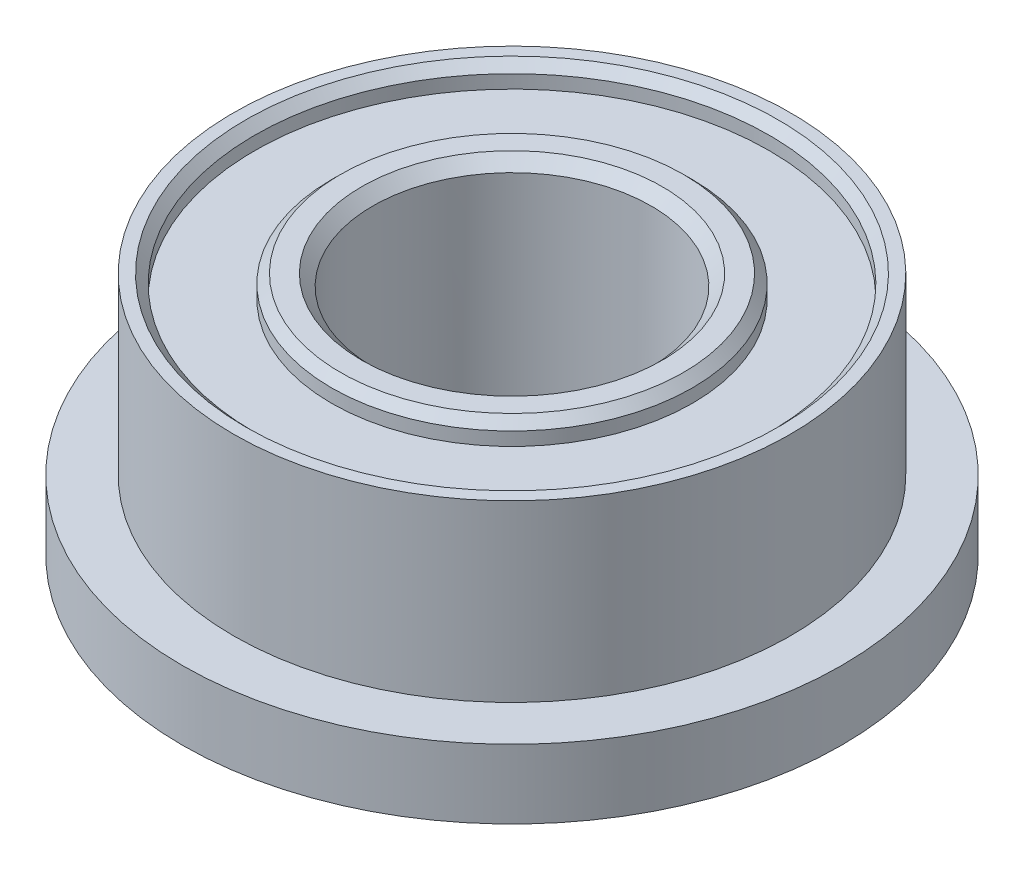
ISO-10303-21;
HEADER;
FILE_DESCRIPTION(('STEP AP214'),'2;1');
FILE_NAME('part.step','',(''),(''),'','','');
FILE_SCHEMA(('AUTOMOTIVE_DESIGN { 1 0 10303 214 1 1 1 1 }'));
ENDSEC;
DATA;
#1=APPLICATION_CONTEXT('core data for automotive mechanical design processes');
#2=APPLICATION_PROTOCOL_DEFINITION('international standard','automotive_design',2000,#1);
#3=PRODUCT_CONTEXT('',#1,'mechanical');
#4=PRODUCT('Part','Part','',(#3));
#5=PRODUCT_RELATED_PRODUCT_CATEGORY('part','',(#4));
#6=PRODUCT_DEFINITION_FORMATION('','',#4);
#7=PRODUCT_DEFINITION_CONTEXT('part definition',#1,'design');
#8=PRODUCT_DEFINITION('design','',#6,#7);
#9=PRODUCT_DEFINITION_SHAPE('','',#8);
#10=(LENGTH_UNIT() NAMED_UNIT(*) SI_UNIT(.MILLI.,.METRE.));
#11=(NAMED_UNIT(*) PLANE_ANGLE_UNIT() SI_UNIT($,.RADIAN.));
#12=(NAMED_UNIT(*) SI_UNIT($,.STERADIAN.) SOLID_ANGLE_UNIT());
#13=UNCERTAINTY_MEASURE_WITH_UNIT(LENGTH_MEASURE(1.E-05),#10,'distance_accuracy_value','');
#14=(GEOMETRIC_REPRESENTATION_CONTEXT(3) GLOBAL_UNCERTAINTY_ASSIGNED_CONTEXT((#13)) GLOBAL_UNIT_ASSIGNED_CONTEXT((#10,
#11,#12)) REPRESENTATION_CONTEXT('',''));
#15=CARTESIAN_POINT('',(0.,0.,0.));
#16=DIRECTION('',(0.,0.,1.));
#17=DIRECTION('',(1.,0.,0.));
#18=AXIS2_PLACEMENT_3D('',#15,#16,#17);
#19=CARTESIAN_POINT('',(0.,-8.02640000000565,0.));
#20=DIRECTION('',(0.,-1.,0.));
#21=DIRECTION('',(0.,0.,-1.));
#22=AXIS2_PLACEMENT_3D('',#19,#20,#21);
#23=CONICAL_SURFACE('',#22,1.71449999996074,0.7853981634499);
#24=CARTESIAN_POINT('',(0.,-8.02640000000565,0.));
#25=DIRECTION('',(0.,-1.,0.));
#26=DIRECTION('',(0.,0.,-1.));
#27=AXIS2_PLACEMENT_3D('',#24,#25,#26);
#28=CIRCLE('',#27,1.71449999996074);
#29=CARTESIAN_POINT('',(0.,-8.02640000000565,-1.71449999996074));
#30=VERTEX_POINT('',#29);
#31=EDGE_CURVE('E18',#30,#30,#28,.F.);
#32=ORIENTED_EDGE('',*,*,#31,.F.);
#33=EDGE_LOOP('',(#32));
#34=FACE_BOUND('',#33,.T.);
#35=CARTESIAN_POINT('',(0.,-7.8994,0.));
#36=DIRECTION('',(0.,1.,0.));
#37=DIRECTION('',(0.,0.,1.));
#38=AXIS2_PLACEMENT_3D('',#35,#36,#37);
#39=CIRCLE('',#38,1.5875);
#40=CARTESIAN_POINT('',(0.,-7.8994,1.5875));
#41=VERTEX_POINT('',#40);
#42=EDGE_CURVE('E30',#41,#41,#39,.T.);
#43=ORIENTED_EDGE('',*,*,#42,.T.);
#44=EDGE_LOOP('',(#43));
#45=FACE_BOUND('',#44,.T.);
#46=ADVANCED_FACE('F15',(#34,#45),#23,.F.);
#47=CARTESIAN_POINT('',(0.,-8.0264,0.));
#48=DIRECTION('',(0.,1.,0.));
#49=DIRECTION('',(0.,0.,1.));
#50=AXIS2_PLACEMENT_3D('',#47,#48,#49);
#51=CYLINDRICAL_SURFACE('',#50,1.5875);
#52=CARTESIAN_POINT('',(0.,-5.37464000001364,0.));
#53=DIRECTION('',(0.,1.,0.));
#54=DIRECTION('',(-0.990358822094107,0.,-0.138525822503868));
#55=AXIS2_PLACEMENT_3D('',#52,#53,#54);
#56=CIRCLE('',#55,1.58749999998275);
#57=CARTESIAN_POINT('',(-1.57219463005731,-5.37464000001364,-0.219909743222502));
#58=VERTEX_POINT('',#57);
#59=EDGE_CURVE('E67',#58,#58,#56,.T.);
#60=ORIENTED_EDGE('',*,*,#59,.T.);
#61=EDGE_LOOP('',(#60));
#62=FACE_BOUND('',#61,.T.);
#63=ORIENTED_EDGE('',*,*,#42,.F.);
#64=EDGE_LOOP('',(#63));
#65=FACE_BOUND('',#64,.T.);
#66=ADVANCED_FACE('F266',(#62,#65),#51,.F.);
#67=CARTESIAN_POINT('',(0.,-8.0264,0.));
#68=DIRECTION('',(0.,-1.,0.));
#69=DIRECTION('',(0.,0.,-1.));
#70=AXIS2_PLACEMENT_3D('',#67,#68,#69);
#71=PLANE('',#70);
#72=ORIENTED_EDGE('',*,*,#31,.T.);
#73=EDGE_LOOP('',(#72));
#74=FACE_BOUND('',#73,.T.);
#75=CARTESIAN_POINT('',(0.,-8.02640000000565,0.));
#76=DIRECTION('',(0.,1.,0.));
#77=DIRECTION('',(0.,0.,1.));
#78=AXIS2_PLACEMENT_3D('',#75,#76,#77);
#79=CIRCLE('',#78,1.95580000005167);
#80=CARTESIAN_POINT('',(0.,-8.02640000000565,1.95580000005167));
#81=VERTEX_POINT('',#80);
#82=EDGE_CURVE('E65',#81,#81,#79,.T.);
#83=ORIENTED_EDGE('',*,*,#82,.F.);
#84=EDGE_LOOP('',(#83));
#85=FACE_BOUND('',#84,.T.);
#86=ADVANCED_FACE('F257',(#74,#85),#71,.T.);
#87=CARTESIAN_POINT('',(0.,-5.24764000005007,0.));
#88=DIRECTION('',(0.,1.,0.));
#89=DIRECTION('',(0.,0.,1.));
#90=AXIS2_PLACEMENT_3D('',#87,#88,#89);
#91=CONICAL_SURFACE('',#90,1.71449999995877,0.785398163446465);
#92=CARTESIAN_POINT('',(0.,-5.24763999999181,0.));
#93=DIRECTION('',(0.,1.,0.));
#94=DIRECTION('',(0.,0.,1.));
#95=AXIS2_PLACEMENT_3D('',#92,#93,#94);
#96=CIRCLE('',#95,1.71450000001704);
#97=CARTESIAN_POINT('',(0.,-5.24763999999181,1.71450000001704));
#98=VERTEX_POINT('',#97);
#99=EDGE_CURVE('E63',#98,#98,#96,.T.);
#100=ORIENTED_EDGE('',*,*,#99,.T.);
#101=EDGE_LOOP('',(#100));
#102=FACE_BOUND('',#101,.T.);
#103=ORIENTED_EDGE('',*,*,#59,.F.);
#104=EDGE_LOOP('',(#103));
#105=FACE_BOUND('',#104,.T.);
#106=ADVANCED_FACE('F249',(#102,#105),#91,.F.);
#107=CARTESIAN_POINT('',(0.,-7.92480000001206,0.));
#108=DIRECTION('',(0.,1.,0.));
#109=DIRECTION('',(0.,0.,1.));
#110=AXIS2_PLACEMENT_3D('',#107,#108,#109);
#111=CONICAL_SURFACE('',#110,2.05740000002005,0.785398163273348);
#112=ORIENTED_EDGE('',*,*,#82,.T.);
#113=EDGE_LOOP('',(#112));
#114=FACE_BOUND('',#113,.T.);
#115=CARTESIAN_POINT('',(0.,-7.9248,0.));
#116=DIRECTION('',(0.,-1.,0.));
#117=DIRECTION('',(0.,0.,-1.));
#118=AXIS2_PLACEMENT_3D('',#115,#116,#117);
#119=CIRCLE('',#118,2.0574);
#120=CARTESIAN_POINT('',(0.,-7.9248,-2.0574));
#121=VERTEX_POINT('',#120);
#122=EDGE_CURVE('E62',#121,#121,#119,.F.);
#123=ORIENTED_EDGE('',*,*,#122,.F.);
#124=EDGE_LOOP('',(#123));
#125=FACE_BOUND('',#124,.T.);
#126=ADVANCED_FACE('F240',(#114,#125),#111,.T.);
#127=CARTESIAN_POINT('',(0.,-5.24764,0.));
#128=DIRECTION('',(0.,-1.,0.));
#129=DIRECTION('',(0.,0.,-1.));
#130=AXIS2_PLACEMENT_3D('',#127,#128,#129);
#131=PLANE('',#130);
#132=ORIENTED_EDGE('',*,*,#99,.F.);
#133=EDGE_LOOP('',(#132));
#134=FACE_BOUND('',#133,.T.);
#135=CARTESIAN_POINT('',(0.,-5.24763999999323,0.));
#136=DIRECTION('',(0.,-1.,0.));
#137=DIRECTION('',(0.,0.,-1.));
#138=AXIS2_PLACEMENT_3D('',#135,#136,#137);
#139=CIRCLE('',#138,1.95579999999538);
#140=CARTESIAN_POINT('',(0.,-5.24763999999323,-1.95579999999538));
#141=VERTEX_POINT('',#140);
#142=EDGE_CURVE('E59',#141,#141,#139,.T.);
#143=ORIENTED_EDGE('',*,*,#142,.F.);
#144=EDGE_LOOP('',(#143));
#145=FACE_BOUND('',#144,.T.);
#146=ADVANCED_FACE('F231',(#134,#145),#131,.F.);
#147=CARTESIAN_POINT('',(0.,-7.5184,0.));
#148=DIRECTION('',(0.,-1.,0.));
#149=DIRECTION('',(0.,0.,-1.));
#150=AXIS2_PLACEMENT_3D('',#147,#148,#149);
#151=CYLINDRICAL_SURFACE('',#150,2.0574);
#152=CARTESIAN_POINT('',(0.,-7.5184,0.));
#153=DIRECTION('',(0.,-1.,0.));
#154=DIRECTION('',(0.,0.,-1.));
#155=AXIS2_PLACEMENT_3D('',#152,#153,#154);
#156=CIRCLE('',#155,2.0574);
#157=CARTESIAN_POINT('',(0.,-7.5184,-2.0574));
#158=VERTEX_POINT('',#157);
#159=EDGE_CURVE('E56',#158,#158,#156,.F.);
#160=ORIENTED_EDGE('',*,*,#159,.F.);
#161=EDGE_LOOP('',(#160));
#162=FACE_BOUND('',#161,.T.);
#163=ORIENTED_EDGE('',*,*,#122,.T.);
#164=EDGE_LOOP('',(#163));
#165=FACE_BOUND('',#164,.T.);
#166=ADVANCED_FACE('F222',(#162,#165),#151,.T.);
#167=CARTESIAN_POINT('',(0.,-5.34923999998682,0.));
#168=DIRECTION('',(0.,-1.,0.));
#169=DIRECTION('',(0.,0.,-1.));
#170=AXIS2_PLACEMENT_3D('',#167,#168,#169);
#171=CONICAL_SURFACE('',#170,2.05739999996572,0.785398163283033);
#172=ORIENTED_EDGE('',*,*,#142,.T.);
#173=EDGE_LOOP('',(#172));
#174=FACE_BOUND('',#173,.T.);
#175=CARTESIAN_POINT('',(0.,-5.34924,0.));
#176=DIRECTION('',(0.,1.,0.));
#177=DIRECTION('',(0.,0.,1.));
#178=AXIS2_PLACEMENT_3D('',#175,#176,#177);
#179=CIRCLE('',#178,2.0574);
#180=CARTESIAN_POINT('',(0.,-5.34924,2.0574));
#181=VERTEX_POINT('',#180);
#182=EDGE_CURVE('E55',#181,#181,#179,.F.);
#183=ORIENTED_EDGE('',*,*,#182,.F.);
#184=EDGE_LOOP('',(#183));
#185=FACE_BOUND('',#184,.T.);
#186=ADVANCED_FACE('F213',(#174,#185),#171,.T.);
#187=CARTESIAN_POINT('',(0.,-7.5184,0.));
#188=DIRECTION('',(0.,-1.,0.));
#189=DIRECTION('',(0.,0.,-1.));
#190=AXIS2_PLACEMENT_3D('',#187,#188,#189);
#191=PLANE('',#190);
#192=ORIENTED_EDGE('',*,*,#159,.T.);
#193=EDGE_LOOP('',(#192));
#194=FACE_BOUND('',#193,.T.);
#195=CARTESIAN_POINT('',(0.,-7.5184,0.));
#196=DIRECTION('',(0.,-1.,0.));
#197=DIRECTION('',(0.,0.,-1.));
#198=AXIS2_PLACEMENT_3D('',#195,#196,#197);
#199=CIRCLE('',#198,2.9337);
#200=CARTESIAN_POINT('',(0.,-7.5184,-2.9337));
#201=VERTEX_POINT('',#200);
#202=EDGE_CURVE('E52',#201,#201,#199,.T.);
#203=ORIENTED_EDGE('',*,*,#202,.T.);
#204=EDGE_LOOP('',(#203));
#205=FACE_BOUND('',#204,.T.);
#206=ADVANCED_FACE('F204',(#194,#205),#191,.T.);
#207=CARTESIAN_POINT('',(0.,-5.50164,0.));
#208=DIRECTION('',(0.,1.,0.));
#209=DIRECTION('',(0.,0.,1.));
#210=AXIS2_PLACEMENT_3D('',#207,#208,#209);
#211=CYLINDRICAL_SURFACE('',#210,2.0574);
#212=CARTESIAN_POINT('',(0.,-5.50164,0.));
#213=DIRECTION('',(0.,1.,0.));
#214=DIRECTION('',(0.,0.,1.));
#215=AXIS2_PLACEMENT_3D('',#212,#213,#214);
#216=CIRCLE('',#215,2.0574);
#217=CARTESIAN_POINT('',(0.,-5.50164,2.0574));
#218=VERTEX_POINT('',#217);
#219=EDGE_CURVE('E49',#218,#218,#216,.F.);
#220=ORIENTED_EDGE('',*,*,#219,.F.);
#221=EDGE_LOOP('',(#220));
#222=FACE_BOUND('',#221,.T.);
#223=ORIENTED_EDGE('',*,*,#182,.T.);
#224=EDGE_LOOP('',(#223));
#225=FACE_BOUND('',#224,.T.);
#226=ADVANCED_FACE('F195',(#222,#225),#211,.T.);
#227=CARTESIAN_POINT('',(0.,-7.5184,0.));
#228=DIRECTION('',(0.,-1.,0.));
#229=DIRECTION('',(0.,0.,-1.));
#230=AXIS2_PLACEMENT_3D('',#227,#228,#229);
#231=CYLINDRICAL_SURFACE('',#230,2.9337);
#232=CARTESIAN_POINT('',(0.,-7.9248000000689,0.));
#233=DIRECTION('',(0.,-1.,0.));
#234=DIRECTION('',(0.990358822092662,0.,0.1385258225142));
#235=AXIS2_PLACEMENT_3D('',#232,#233,#234);
#236=CIRCLE('',#235,2.93369999999307);
#237=CARTESIAN_POINT('',(2.90541567636637,-7.9248000000689,0.406393205508948));
#238=VERTEX_POINT('',#237);
#239=EDGE_CURVE('E48',#238,#238,#236,.T.);
#240=ORIENTED_EDGE('',*,*,#239,.T.);
#241=EDGE_LOOP('',(#240));
#242=FACE_BOUND('',#241,.T.);
#243=ORIENTED_EDGE('',*,*,#202,.F.);
#244=EDGE_LOOP('',(#243));
#245=FACE_BOUND('',#244,.T.);
#246=ADVANCED_FACE('F186',(#242,#245),#231,.F.);
#247=CARTESIAN_POINT('',(0.,-5.50164,0.));
#248=DIRECTION('',(0.,1.,0.));
#249=DIRECTION('',(0.,0.,1.));
#250=AXIS2_PLACEMENT_3D('',#247,#248,#249);
#251=PLANE('',#250);
#252=ORIENTED_EDGE('',*,*,#219,.T.);
#253=EDGE_LOOP('',(#252));
#254=FACE_BOUND('',#253,.T.);
#255=CARTESIAN_POINT('',(0.,-5.50164,0.));
#256=DIRECTION('',(0.,1.,0.));
#257=DIRECTION('',(0.,0.,1.));
#258=AXIS2_PLACEMENT_3D('',#255,#256,#257);
#259=CIRCLE('',#258,2.9337);
#260=CARTESIAN_POINT('',(0.,-5.50164,2.9337));
#261=VERTEX_POINT('',#260);
#262=EDGE_CURVE('E45',#261,#261,#259,.T.);
#263=ORIENTED_EDGE('',*,*,#262,.T.);
#264=EDGE_LOOP('',(#263));
#265=FACE_BOUND('',#264,.T.);
#266=ADVANCED_FACE('F177',(#254,#265),#251,.T.);
#267=CARTESIAN_POINT('',(0.,-8.02640000000565,0.));
#268=DIRECTION('',(0.,-1.,0.));
#269=DIRECTION('',(0.,0.,-1.));
#270=AXIS2_PLACEMENT_3D('',#267,#268,#269);
#271=CONICAL_SURFACE('',#270,3.03529999990515,0.785398163277642);
#272=CARTESIAN_POINT('',(0.,-8.02640000006249,0.));
#273=DIRECTION('',(0.,-1.,0.));
#274=DIRECTION('',(0.,0.,-1.));
#275=AXIS2_PLACEMENT_3D('',#272,#273,#274);
#276=CIRCLE('',#275,3.03529999996199);
#277=CARTESIAN_POINT('',(0.,-8.02640000006249,-3.03529999996199));
#278=VERTEX_POINT('',#277);
#279=EDGE_CURVE('E42',#278,#278,#276,.F.);
#280=ORIENTED_EDGE('',*,*,#279,.F.);
#281=EDGE_LOOP('',(#280));
#282=FACE_BOUND('',#281,.T.);
#283=ORIENTED_EDGE('',*,*,#239,.F.);
#284=EDGE_LOOP('',(#283));
#285=FACE_BOUND('',#284,.T.);
#286=ADVANCED_FACE('F169',(#282,#285),#271,.F.);
#287=CARTESIAN_POINT('',(0.,-5.50164,0.));
#288=DIRECTION('',(0.,1.,0.));
#289=DIRECTION('',(0.,0.,1.));
#290=AXIS2_PLACEMENT_3D('',#287,#288,#289);
#291=CYLINDRICAL_SURFACE('',#290,2.9337);
#292=CARTESIAN_POINT('',(0.,-5.34923999998682,0.));
#293=DIRECTION('',(0.,1.,0.));
#294=DIRECTION('',(-0.990358822092662,0.,-0.1385258225142));
#295=AXIS2_PLACEMENT_3D('',#292,#293,#294);
#296=CIRCLE('',#295,2.93369999999307);
#297=CARTESIAN_POINT('',(-2.90541567636637,-5.34923999998682,-0.406393205508948));
#298=VERTEX_POINT('',#297);
#299=EDGE_CURVE('E41',#298,#298,#296,.T.);
#300=ORIENTED_EDGE('',*,*,#299,.T.);
#301=EDGE_LOOP('',(#300));
#302=FACE_BOUND('',#301,.T.);
#303=ORIENTED_EDGE('',*,*,#262,.F.);
#304=EDGE_LOOP('',(#303));
#305=FACE_BOUND('',#304,.T.);
#306=ADVANCED_FACE('F90',(#302,#305),#291,.F.);
#307=CARTESIAN_POINT('',(0.,-8.0264,0.));
#308=DIRECTION('',(0.,-1.,0.));
#309=DIRECTION('',(0.,0.,-1.));
#310=AXIS2_PLACEMENT_3D('',#307,#308,#309);
#311=PLANE('',#310);
#312=ORIENTED_EDGE('',*,*,#279,.T.);
#313=EDGE_LOOP('',(#312));
#314=FACE_BOUND('',#313,.T.);
#315=CARTESIAN_POINT('',(0.,-8.0264,0.));
#316=DIRECTION('',(0.,-1.,0.));
#317=DIRECTION('',(0.,0.,-1.));
#318=AXIS2_PLACEMENT_3D('',#315,#316,#317);
#319=CIRCLE('',#318,3.7592);
#320=CARTESIAN_POINT('',(0.,-8.0264,-3.7592));
#321=VERTEX_POINT('',#320);
#322=EDGE_CURVE('E38',#321,#321,#319,.F.);
#323=ORIENTED_EDGE('',*,*,#322,.F.);
#324=EDGE_LOOP('',(#323));
#325=FACE_BOUND('',#324,.T.);
#326=ADVANCED_FACE('F96',(#314,#325),#311,.T.);
#327=CARTESIAN_POINT('',(0.,-5.24763999999323,0.));
#328=DIRECTION('',(0.,1.,0.));
#329=DIRECTION('',(0.,0.,1.));
#330=AXIS2_PLACEMENT_3D('',#327,#328,#329);
#331=CONICAL_SURFACE('',#330,3.03529999996341,0.785398163290025);
#332=CARTESIAN_POINT('',(0.,-5.24763999999323,0.));
#333=DIRECTION('',(0.,1.,0.));
#334=DIRECTION('',(0.,0.,1.));
#335=AXIS2_PLACEMENT_3D('',#332,#333,#334);
#336=CIRCLE('',#335,3.03529999996341);
#337=CARTESIAN_POINT('',(0.,-5.24763999999322,3.03529999996341));
#338=VERTEX_POINT('',#337);
#339=EDGE_CURVE('E35',#338,#338,#336,.T.);
#340=ORIENTED_EDGE('',*,*,#339,.T.);
#341=EDGE_LOOP('',(#340));
#342=FACE_BOUND('',#341,.T.);
#343=ORIENTED_EDGE('',*,*,#299,.F.);
#344=EDGE_LOOP('',(#343));
#345=FACE_BOUND('',#344,.T.);
#346=ADVANCED_FACE('F93',(#342,#345),#331,.F.);
#347=CARTESIAN_POINT('',(0.,-7.239,0.));
#348=DIRECTION('',(0.,-1.,0.));
#349=DIRECTION('',(0.,0.,-1.));
#350=AXIS2_PLACEMENT_3D('',#347,#348,#349);
#351=CYLINDRICAL_SURFACE('',#350,3.7592);
#352=CARTESIAN_POINT('',(0.,-7.239,0.));
#353=DIRECTION('',(0.,-1.,0.));
#354=DIRECTION('',(0.,0.,-1.));
#355=AXIS2_PLACEMENT_3D('',#352,#353,#354);
#356=CIRCLE('',#355,3.7592);
#357=CARTESIAN_POINT('',(0.,-7.239,-3.7592));
#358=VERTEX_POINT('',#357);
#359=EDGE_CURVE('E27',#358,#358,#356,.T.);
#360=ORIENTED_EDGE('',*,*,#359,.T.);
#361=EDGE_LOOP('',(#360));
#362=FACE_BOUND('',#361,.T.);
#363=ORIENTED_EDGE('',*,*,#322,.T.);
#364=EDGE_LOOP('',(#363));
#365=FACE_BOUND('',#364,.T.);
#366=ADVANCED_FACE('F95',(#362,#365),#351,.T.);
#367=CARTESIAN_POINT('',(0.,-5.24764,0.));
#368=DIRECTION('',(0.,-1.,0.));
#369=DIRECTION('',(0.,0.,-1.));
#370=AXIS2_PLACEMENT_3D('',#367,#368,#369);
#371=PLANE('',#370);
#372=ORIENTED_EDGE('',*,*,#339,.F.);
#373=EDGE_LOOP('',(#372));
#374=FACE_BOUND('',#373,.T.);
#375=CARTESIAN_POINT('',(0.,-5.24764,0.));
#376=DIRECTION('',(0.,1.,0.));
#377=DIRECTION('',(0.,0.,1.));
#378=AXIS2_PLACEMENT_3D('',#375,#376,#377);
#379=CIRCLE('',#378,3.175);
#380=CARTESIAN_POINT('',(0.,-5.24764,3.175));
#381=VERTEX_POINT('',#380);
#382=EDGE_CURVE('E22',#381,#381,#379,.F.);
#383=ORIENTED_EDGE('',*,*,#382,.F.);
#384=EDGE_LOOP('',(#383));
#385=FACE_BOUND('',#384,.T.);
#386=ADVANCED_FACE('F104',(#374,#385),#371,.F.);
#387=CARTESIAN_POINT('',(0.,-7.239,0.));
#388=DIRECTION('',(0.,-1.,0.));
#389=DIRECTION('',(0.,0.,-1.));
#390=AXIS2_PLACEMENT_3D('',#387,#388,#389);
#391=PLANE('',#390);
#392=CARTESIAN_POINT('',(0.,-7.239,0.));
#393=DIRECTION('',(0.,1.,0.));
#394=DIRECTION('',(0.,0.,1.));
#395=AXIS2_PLACEMENT_3D('',#392,#393,#394);
#396=CIRCLE('',#395,3.175);
#397=CARTESIAN_POINT('',(0.,-7.239,3.175));
#398=VERTEX_POINT('',#397);
#399=EDGE_CURVE('E10',#398,#398,#396,.T.);
#400=ORIENTED_EDGE('',*,*,#399,.F.);
#401=EDGE_LOOP('',(#400));
#402=FACE_BOUND('',#401,.T.);
#403=ORIENTED_EDGE('',*,*,#359,.F.);
#404=EDGE_LOOP('',(#403));
#405=FACE_BOUND('',#404,.T.);
#406=ADVANCED_FACE('F111',(#402,#405),#391,.F.);
#407=CARTESIAN_POINT('',(0.,-8.0264,0.));
#408=DIRECTION('',(0.,1.,0.));
#409=DIRECTION('',(0.,0.,1.));
#410=AXIS2_PLACEMENT_3D('',#407,#408,#409);
#411=CYLINDRICAL_SURFACE('',#410,3.175);
#412=ORIENTED_EDGE('',*,*,#399,.T.);
#413=EDGE_LOOP('',(#412));
#414=FACE_BOUND('',#413,.T.);
#415=ORIENTED_EDGE('',*,*,#382,.T.);
#416=EDGE_LOOP('',(#415));
#417=FACE_BOUND('',#416,.T.);
#418=ADVANCED_FACE('F109',(#414,#417),#411,.T.);
#419=CLOSED_SHELL('',(#46,#66,#86,#106,#126,#146,#166,#186,#206,#226,#246,#266,#286,#306,#326,
#346,#366,#386,#406,#418));
#420=MANIFOLD_SOLID_BREP('B1',#419);
#421=ADVANCED_BREP_SHAPE_REPRESENTATION('',(#18,#420),#14);
#422=SHAPE_DEFINITION_REPRESENTATION(#9,#421);
ENDSEC;
END-ISO-10303-21;
